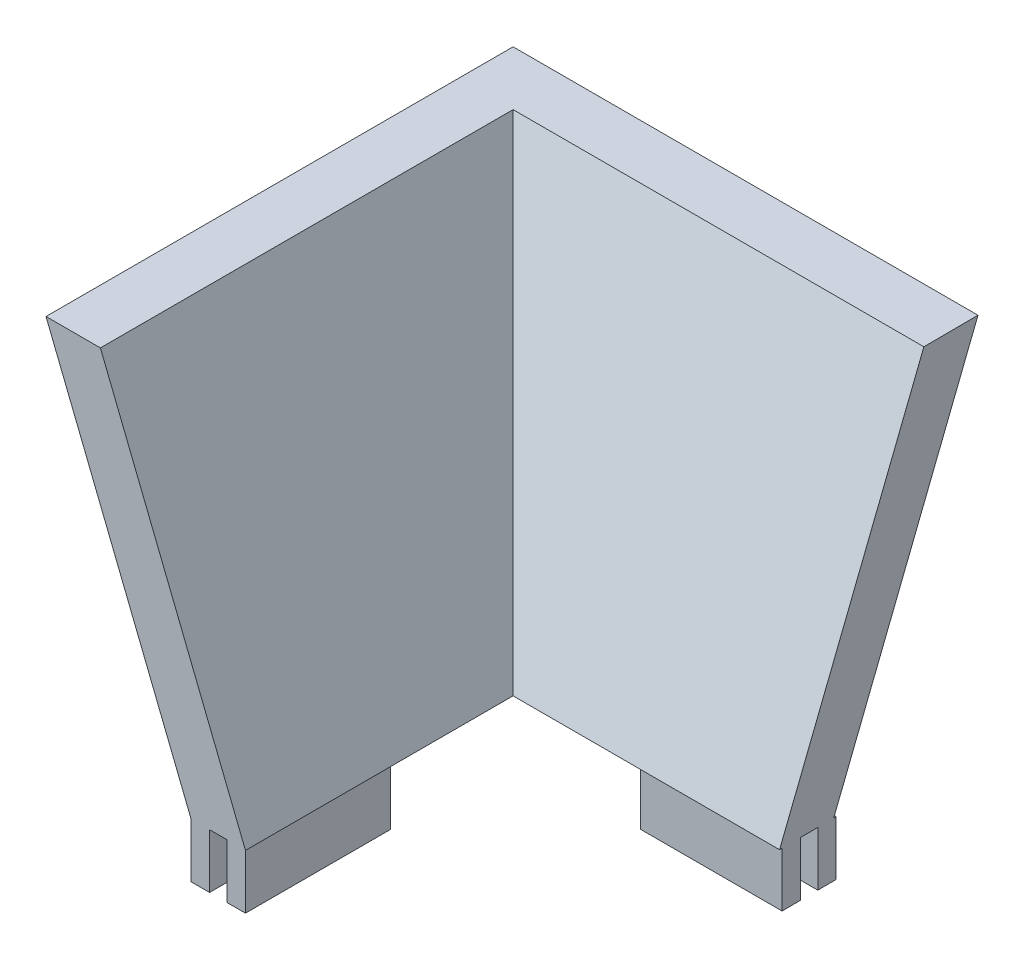
ISO-10303-21;
HEADER;
FILE_DESCRIPTION(('STEP AP214'),'2;1');
FILE_NAME('part.step','',(''),(''),'','','');
FILE_SCHEMA(('AUTOMOTIVE_DESIGN { 1 0 10303 214 1 1 1 1 }'));
ENDSEC;
DATA;
#1=APPLICATION_CONTEXT('core data for automotive mechanical design processes');
#2=APPLICATION_PROTOCOL_DEFINITION('international standard','automotive_design',2000,#1);
#3=PRODUCT_CONTEXT('',#1,'mechanical');
#4=PRODUCT('Part','Part','',(#3));
#5=PRODUCT_RELATED_PRODUCT_CATEGORY('part','',(#4));
#6=PRODUCT_DEFINITION_FORMATION('','',#4);
#7=PRODUCT_DEFINITION_CONTEXT('part definition',#1,'design');
#8=PRODUCT_DEFINITION('design','',#6,#7);
#9=PRODUCT_DEFINITION_SHAPE('','',#8);
#10=(LENGTH_UNIT() NAMED_UNIT(*) SI_UNIT(.MILLI.,.METRE.));
#11=(NAMED_UNIT(*) PLANE_ANGLE_UNIT() SI_UNIT($,.RADIAN.));
#12=(NAMED_UNIT(*) SI_UNIT($,.STERADIAN.) SOLID_ANGLE_UNIT());
#13=UNCERTAINTY_MEASURE_WITH_UNIT(LENGTH_MEASURE(1.E-05),#10,'distance_accuracy_value','');
#14=(GEOMETRIC_REPRESENTATION_CONTEXT(3) GLOBAL_UNCERTAINTY_ASSIGNED_CONTEXT((#13)) GLOBAL_UNIT_ASSIGNED_CONTEXT((#10,
#11,#12)) REPRESENTATION_CONTEXT('',''));
#15=CARTESIAN_POINT('',(0.,0.,0.));
#16=DIRECTION('',(0.,0.,1.));
#17=DIRECTION('',(1.,0.,0.));
#18=AXIS2_PLACEMENT_3D('',#15,#16,#17);
#19=CARTESIAN_POINT('',(0.,0.,0.));
#20=DIRECTION('',(0.,1.,0.));
#21=DIRECTION('',(0.,0.,1.));
#22=AXIS2_PLACEMENT_3D('',#19,#20,#21);
#23=PLANE('',#22);
#24=DIRECTION('',(-0.00505105859608031,0.,-0.999987243322163));
#25=VECTOR('',#24,1.);
#26=CARTESIAN_POINT('',(113.405509539528,0.,-0.572825181148791));
#27=LINE('',#26,#25);
#28=CARTESIAN_POINT('',(112.365335941716,0.,-206.502));
#29=VERTEX_POINT('',#28);
#30=CARTESIAN_POINT('',(112.360845493341,0.,-207.390999999989));
#31=VERTEX_POINT('',#30);
#32=EDGE_CURVE('E486',#29,#31,#27,.T.);
#33=ORIENTED_EDGE('',*,*,#32,.F.);
#34=DIRECTION('',(1.,0.,0.));
#35=VECTOR('',#34,1.);
#36=CARTESIAN_POINT('',(19.05,0.,-206.502));
#37=LINE('',#36,#35);
#38=CARTESIAN_POINT('',(19.05,0.,-206.502));
#39=VERTEX_POINT('',#38);
#40=EDGE_CURVE('E393',#39,#29,#37,.T.);
#41=ORIENTED_EDGE('',*,*,#40,.F.);
#42=DIRECTION('',(0.,0.,-1.));
#43=VECTOR('',#42,1.);
#44=CARTESIAN_POINT('',(19.05,0.,-19.05));
#45=LINE('',#44,#43);
#46=CARTESIAN_POINT('',(19.05,0.,-163.576));
#47=VERTEX_POINT('',#46);
#48=EDGE_CURVE('E389',#47,#39,#45,.T.);
#49=ORIENTED_EDGE('',*,*,#48,.F.);
#50=DIRECTION('',(1.,0.,0.));
#51=VECTOR('',#50,1.);
#52=CARTESIAN_POINT('',(12.573,0.,-163.576));
#53=LINE('',#52,#51);
#54=CARTESIAN_POINT('',(12.573,0.,-163.576));
#55=VERTEX_POINT('',#54);
#56=EDGE_CURVE('E411',#55,#47,#53,.T.);
#57=ORIENTED_EDGE('',*,*,#56,.F.);
#58=DIRECTION('',(0.,0.,-1.));
#59=VECTOR('',#58,1.);
#60=CARTESIAN_POINT('',(12.573,0.,-61.976));
#61=LINE('',#60,#59);
#62=CARTESIAN_POINT('',(12.573,0.,-112.776));
#63=VERTEX_POINT('',#62);
#64=EDGE_CURVE('E412',#63,#55,#61,.T.);
#65=ORIENTED_EDGE('',*,*,#64,.F.);
#66=DIRECTION('',(-1.,0.,0.));
#67=VECTOR('',#66,1.);
#68=CARTESIAN_POINT('',(0.,0.,-112.776));
#69=LINE('',#68,#67);
#70=CARTESIAN_POINT('',(6.477,0.,-112.776));
#71=VERTEX_POINT('',#70);
#72=EDGE_CURVE('E672',#63,#71,#69,.T.);
#73=ORIENTED_EDGE('',*,*,#72,.T.);
#74=DIRECTION('',(0.,0.,1.));
#75=VECTOR('',#74,1.);
#76=CARTESIAN_POINT('',(6.477,0.,-61.976));
#77=LINE('',#76,#75);
#78=CARTESIAN_POINT('',(6.477,0.,-163.576));
#79=VERTEX_POINT('',#78);
#80=EDGE_CURVE('E627',#79,#71,#77,.T.);
#81=ORIENTED_EDGE('',*,*,#80,.F.);
#82=DIRECTION('',(1.,0.,0.));
#83=VECTOR('',#82,1.);
#84=CARTESIAN_POINT('',(6.477,0.,-163.576));
#85=LINE('',#84,#83);
#86=CARTESIAN_POINT('',(0.,0.,-163.576));
#87=VERTEX_POINT('',#86);
#88=EDGE_CURVE('E416',#87,#79,#85,.T.);
#89=ORIENTED_EDGE('',*,*,#88,.F.);
#90=DIRECTION('',(0.,0.,-1.));
#91=VECTOR('',#90,1.);
#92=CARTESIAN_POINT('',(0.,0.,0.));
#93=LINE('',#92,#91);
#94=CARTESIAN_POINT('',(0.,0.,-225.552));
#95=VERTEX_POINT('',#94);
#96=EDGE_CURVE('E295',#87,#95,#93,.T.);
#97=ORIENTED_EDGE('',*,*,#96,.T.);
#98=DIRECTION('',(1.,0.,0.));
#99=VECTOR('',#98,1.);
#100=CARTESIAN_POINT('',(0.,0.,-225.552));
#101=LINE('',#100,#99);
#102=CARTESIAN_POINT('',(62.8650000000334,0.,-225.552));
#103=VERTEX_POINT('',#102);
#104=EDGE_CURVE('E292',#95,#103,#101,.T.);
#105=ORIENTED_EDGE('',*,*,#104,.T.);
#106=DIRECTION('',(0.,0.,-1.));
#107=VECTOR('',#106,1.);
#108=CARTESIAN_POINT('',(62.8650000000334,0.,-226.440999999988));
#109=LINE('',#108,#107);
#110=CARTESIAN_POINT('',(62.8650000000334,0.,-219.963999999988));
#111=VERTEX_POINT('',#110);
#112=EDGE_CURVE('E559',#111,#103,#109,.T.);
#113=ORIENTED_EDGE('',*,*,#112,.F.);
#114=DIRECTION('',(-1.,0.,0.));
#115=VECTOR('',#114,1.);
#116=CARTESIAN_POINT('',(62.8650000000334,0.,-219.963999999988));
#117=LINE('',#116,#115);
#118=CARTESIAN_POINT('',(112.297337723464,0.,-219.963999999989));
#119=VERTEX_POINT('',#118);
#120=EDGE_CURVE('E553',#119,#111,#117,.T.);
#121=ORIENTED_EDGE('',*,*,#120,.F.);
#122=CARTESIAN_POINT('',(112.328129369465,0.,-213.867999999989));
#123=VERTEX_POINT('',#122);
#124=EDGE_CURVE('E492',#123,#119,#27,.T.);
#125=ORIENTED_EDGE('',*,*,#124,.F.);
#126=DIRECTION('',(1.,0.,0.));
#127=VECTOR('',#126,1.);
#128=CARTESIAN_POINT('',(62.8650000000335,0.,-213.867999999988));
#129=LINE('',#128,#127);
#130=CARTESIAN_POINT('',(62.8650000000335,0.,-213.867999999988));
#131=VERTEX_POINT('',#130);
#132=EDGE_CURVE('E515',#131,#123,#129,.T.);
#133=ORIENTED_EDGE('',*,*,#132,.F.);
#134=DIRECTION('',(0.,0.,-1.));
#135=VECTOR('',#134,1.);
#136=CARTESIAN_POINT('',(62.8650000000335,0.,-207.390999999988));
#137=LINE('',#136,#135);
#138=CARTESIAN_POINT('',(62.8650000000335,0.,-207.390999999988));
#139=VERTEX_POINT('',#138);
#140=EDGE_CURVE('E686',#139,#131,#137,.T.);
#141=ORIENTED_EDGE('',*,*,#140,.F.);
#142=DIRECTION('',(-1.,0.,0.));
#143=VECTOR('',#142,1.);
#144=CARTESIAN_POINT('',(62.8650000000335,0.,-207.390999999988));
#145=LINE('',#144,#143);
#146=EDGE_CURVE('E489',#31,#139,#145,.T.);
#147=ORIENTED_EDGE('',*,*,#146,.F.);
#148=EDGE_LOOP('',(#33,#41,#49,#57,#65,#73,#81,#89,#97,#105,#113,#121,#125,#133,#141,#147));
#149=FACE_BOUND('',#148,.T.);
#150=ADVANCED_FACE('F62',(#149),#23,.F.);
#151=CARTESIAN_POINT('',(0.,127.,0.));
#152=DIRECTION('',(0.,1.,0.));
#153=DIRECTION('',(0.,0.,1.));
#154=AXIS2_PLACEMENT_3D('',#151,#152,#153);
#155=PLANE('',#154);
#156=DIRECTION('',(-1.,0.,0.));
#157=VECTOR('',#156,1.);
#158=CARTESIAN_POINT('',(259.08,127.,-257.302));
#159=LINE('',#158,#157);
#160=CARTESIAN_POINT('',(112.108738891709,127.,-257.302));
#161=VERTEX_POINT('',#160);
#162=CARTESIAN_POINT('',(-31.75,127.,-257.302));
#163=VERTEX_POINT('',#162);
#164=EDGE_CURVE('E229',#161,#163,#159,.T.);
#165=ORIENTED_EDGE('',*,*,#164,.F.);
#166=DIRECTION('',(-0.00505105859608031,0.,-0.999987243322163));
#167=VECTOR('',#166,1.);
#168=CARTESIAN_POINT('',(113.405509539528,127.,-0.572825181148791));
#169=LINE('',#168,#167);
#170=CARTESIAN_POINT('',(112.012514997956,127.,-276.352));
#171=VERTEX_POINT('',#170);
#172=EDGE_CURVE('E212',#161,#171,#169,.T.);
#173=ORIENTED_EDGE('',*,*,#172,.T.);
#174=DIRECTION('',(-1.,0.,0.));
#175=VECTOR('',#174,1.);
#176=CARTESIAN_POINT('',(278.13,127.,-276.352));
#177=LINE('',#176,#175);
#178=CARTESIAN_POINT('',(-50.8,127.,-276.352));
#179=VERTEX_POINT('',#178);
#180=EDGE_CURVE('E225',#171,#179,#177,.T.);
#181=ORIENTED_EDGE('',*,*,#180,.T.);
#182=DIRECTION('',(0.,0.,1.));
#183=VECTOR('',#182,1.);
#184=CARTESIAN_POINT('',(-50.8,127.,-276.352));
#185=LINE('',#184,#183);
#186=CARTESIAN_POINT('',(-50.8,127.,-112.776));
#187=VERTEX_POINT('',#186);
#188=EDGE_CURVE('E242',#179,#187,#185,.T.);
#189=ORIENTED_EDGE('',*,*,#188,.T.);
#190=DIRECTION('',(-1.,0.,0.));
#191=VECTOR('',#190,1.);
#192=CARTESIAN_POINT('',(0.,127.,-112.776));
#193=LINE('',#192,#191);
#194=CARTESIAN_POINT('',(-31.75,127.,-112.776));
#195=VERTEX_POINT('',#194);
#196=EDGE_CURVE('E730',#195,#187,#193,.T.);
#197=ORIENTED_EDGE('',*,*,#196,.F.);
#198=DIRECTION('',(0.,0.,1.));
#199=VECTOR('',#198,1.);
#200=CARTESIAN_POINT('',(-31.75,127.,-257.302));
#201=LINE('',#200,#199);
#202=EDGE_CURVE('E318',#163,#195,#201,.T.);
#203=ORIENTED_EDGE('',*,*,#202,.F.);
#204=EDGE_LOOP('',(#165,#173,#181,#189,#197,#203));
#205=FACE_BOUND('',#204,.T.);
#206=ADVANCED_FACE('F223',(#205),#155,.T.);
#207=CARTESIAN_POINT('',(0.,-77.7765517241379,-194.441379310345));
#208=DIRECTION('',(0.,0.371390676354104,0.928476690885259));
#209=DIRECTION('',(0.,-0.928476690885259,0.371390676354104));
#210=AXIS2_PLACEMENT_3D('',#207,#208,#209);
#211=PLANE('',#210);
#212=DIRECTION('',(-0.00187593669821545,0.928475057164789,-0.371390022865916));
#213=VECTOR('',#212,1.);
#214=CARTESIAN_POINT('',(112.425859977093,-77.5807321204548,-194.519707151818));
#215=LINE('',#214,#213);
#216=CARTESIAN_POINT('',(112.269112047963,0.,-225.552));
#217=VERTEX_POINT('',#216);
#218=EDGE_CURVE('E209',#217,#171,#215,.T.);
#219=ORIENTED_EDGE('',*,*,#218,.F.);
#220=EDGE_CURVE('E247',#103,#217,#101,.T.);
#221=ORIENTED_EDGE('',*,*,#220,.F.);
#222=ORIENTED_EDGE('',*,*,#104,.F.);
#223=DIRECTION('',(0.348155311911396,-0.870388279778489,0.348155311911396));
#224=VECTOR('',#223,1.);
#225=CARTESIAN_POINT('',(-50.8,127.,-276.352));
#226=LINE('',#225,#224);
#227=EDGE_CURVE('E240',#179,#95,#226,.T.);
#228=ORIENTED_EDGE('',*,*,#227,.F.);
#229=ORIENTED_EDGE('',*,*,#180,.F.);
#230=EDGE_LOOP('',(#219,#221,#222,#228,#229));
#231=FACE_BOUND('',#230,.T.);
#232=ADVANCED_FACE('F237',(#231),#211,.F.);
#233=CARTESIAN_POINT('',(0.,-71.2075862068965,-178.018965517241));
#234=DIRECTION('',(0.,0.371390676354104,0.928476690885259));
#235=DIRECTION('',(0.,-0.928476690885259,0.371390676354104));
#236=AXIS2_PLACEMENT_3D('',#233,#234,#235);
#237=PLANE('',#236);
#238=ORIENTED_EDGE('',*,*,#40,.T.);
#239=DIRECTION('',(-0.00187593669821545,0.928475057164789,-0.371390022865916));
#240=VECTOR('',#239,1.);
#241=CARTESIAN_POINT('',(112.50881131772,-71.011622121342,-178.097351151463));
#242=LINE('',#241,#240);
#243=EDGE_CURVE('E233',#29,#161,#242,.T.);
#244=ORIENTED_EDGE('',*,*,#243,.T.);
#245=ORIENTED_EDGE('',*,*,#164,.T.);
#246=DIRECTION('',(-0.348155311911396,0.870388279778489,-0.348155311911396));
#247=VECTOR('',#246,1.);
#248=CARTESIAN_POINT('',(19.05,0.,-206.502));
#249=LINE('',#248,#247);
#250=EDGE_CURVE('E392',#39,#163,#249,.T.);
#251=ORIENTED_EDGE('',*,*,#250,.F.);
#252=EDGE_LOOP('',(#238,#244,#245,#251));
#253=FACE_BOUND('',#252,.T.);
#254=ADVANCED_FACE('F265',(#253),#237,.T.);
#255=CARTESIAN_POINT('',(0.,0.,0.));
#256=DIRECTION('',(0.,-1.,0.));
#257=DIRECTION('',(0.,0.,-1.));
#258=AXIS2_PLACEMENT_3D('',#255,#256,#257);
#259=PLANE('',#258);
#260=DIRECTION('',(0.00505105859608031,0.,0.999987243322163));
#261=VECTOR('',#260,1.);
#262=CARTESIAN_POINT('',(113.405509539528,0.,-0.572825181148791));
#263=LINE('',#262,#261);
#264=CARTESIAN_POINT('',(112.264621599588,0.,-226.440999999989));
#265=VERTEX_POINT('',#264);
#266=EDGE_CURVE('E215',#265,#217,#263,.T.);
#267=ORIENTED_EDGE('',*,*,#266,.F.);
#268=DIRECTION('',(1.,0.,0.));
#269=VECTOR('',#268,1.);
#270=CARTESIAN_POINT('',(62.8650000000334,0.,-226.440999999988));
#271=LINE('',#270,#269);
#272=CARTESIAN_POINT('',(62.8650000000334,0.,-226.440999999988));
#273=VERTEX_POINT('',#272);
#274=EDGE_CURVE('E545',#273,#265,#271,.T.);
#275=ORIENTED_EDGE('',*,*,#274,.F.);
#276=EDGE_CURVE('E549',#103,#273,#109,.T.);
#277=ORIENTED_EDGE('',*,*,#276,.F.);
#278=ORIENTED_EDGE('',*,*,#220,.T.);
#279=EDGE_LOOP('',(#267,#275,#277,#278));
#280=FACE_BOUND('',#279,.T.);
#281=ADVANCED_FACE('F363',(#280),#259,.F.);
#282=CARTESIAN_POINT('',(62.8650000000334,-19.05,-219.963999999988));
#283=DIRECTION('',(0.,0.,-1.));
#284=DIRECTION('',(-1.,0.,0.));
#285=AXIS2_PLACEMENT_3D('',#282,#283,#284);
#286=PLANE('',#285);
#287=DIRECTION('',(0.,-1.,0.));
#288=VECTOR('',#287,1.);
#289=CARTESIAN_POINT('',(112.297337723464,-19.05,-219.963999999989));
#290=LINE('',#289,#288);
#291=CARTESIAN_POINT('',(112.297337723464,-19.05,-219.963999999989));
#292=VERTEX_POINT('',#291);
#293=EDGE_CURVE('E491',#119,#292,#290,.T.);
#294=ORIENTED_EDGE('',*,*,#293,.F.);
#295=ORIENTED_EDGE('',*,*,#120,.T.);
#296=DIRECTION('',(0.,1.,0.));
#297=VECTOR('',#296,1.);
#298=CARTESIAN_POINT('',(62.8650000000334,-19.05,-219.963999999988));
#299=LINE('',#298,#297);
#300=CARTESIAN_POINT('',(62.8650000000334,-19.05,-219.963999999988));
#301=VERTEX_POINT('',#300);
#302=EDGE_CURVE('E536',#301,#111,#299,.T.);
#303=ORIENTED_EDGE('',*,*,#302,.F.);
#304=DIRECTION('',(-1.,0.,0.));
#305=VECTOR('',#304,1.);
#306=CARTESIAN_POINT('',(62.8650000000334,-19.05,-219.963999999988));
#307=LINE('',#306,#305);
#308=EDGE_CURVE('E550',#292,#301,#307,.T.);
#309=ORIENTED_EDGE('',*,*,#308,.F.);
#310=EDGE_LOOP('',(#294,#295,#303,#309));
#311=FACE_BOUND('',#310,.T.);
#312=ADVANCED_FACE('F579',(#311),#286,.F.);
#313=CARTESIAN_POINT('',(62.8650000000334,-19.05,-226.440999999988));
#314=DIRECTION('',(0.,0.,1.));
#315=DIRECTION('',(1.,0.,0.));
#316=AXIS2_PLACEMENT_3D('',#313,#314,#315);
#317=PLANE('',#316);
#318=DIRECTION('',(0.,1.,0.));
#319=VECTOR('',#318,1.);
#320=CARTESIAN_POINT('',(112.264621599588,-19.05,-226.440999999989));
#321=LINE('',#320,#319);
#322=CARTESIAN_POINT('',(112.264621599588,-19.05,-226.440999999989));
#323=VERTEX_POINT('',#322);
#324=EDGE_CURVE('E755',#323,#265,#321,.T.);
#325=ORIENTED_EDGE('',*,*,#324,.F.);
#326=DIRECTION('',(1.,0.,0.));
#327=VECTOR('',#326,1.);
#328=CARTESIAN_POINT('',(62.8650000000334,-19.05,-226.440999999988));
#329=LINE('',#328,#327);
#330=CARTESIAN_POINT('',(62.8650000000334,-19.05,-226.440999999988));
#331=VERTEX_POINT('',#330);
#332=EDGE_CURVE('E544',#331,#323,#329,.T.);
#333=ORIENTED_EDGE('',*,*,#332,.F.);
#334=DIRECTION('',(0.,1.,0.));
#335=VECTOR('',#334,1.);
#336=CARTESIAN_POINT('',(62.8650000000334,-19.05,-226.440999999988));
#337=LINE('',#336,#335);
#338=EDGE_CURVE('E540',#331,#273,#337,.T.);
#339=ORIENTED_EDGE('',*,*,#338,.T.);
#340=ORIENTED_EDGE('',*,*,#274,.T.);
#341=EDGE_LOOP('',(#325,#333,#339,#340));
#342=FACE_BOUND('',#341,.T.);
#343=ADVANCED_FACE('F580',(#342),#317,.F.);
#344=CARTESIAN_POINT('',(0.,-19.05,0.));
#345=DIRECTION('',(0.,-1.,0.));
#346=DIRECTION('',(0.,0.,-1.));
#347=AXIS2_PLACEMENT_3D('',#344,#345,#346);
#348=PLANE('',#347);
#349=ORIENTED_EDGE('',*,*,#332,.T.);
#350=DIRECTION('',(0.00505105859608031,0.,0.999987243322163));
#351=VECTOR('',#350,1.);
#352=CARTESIAN_POINT('',(113.405509539528,-19.05,-0.572825181148791));
#353=LINE('',#352,#351);
#354=EDGE_CURVE('E232',#323,#292,#353,.T.);
#355=ORIENTED_EDGE('',*,*,#354,.T.);
#356=ORIENTED_EDGE('',*,*,#308,.T.);
#357=DIRECTION('',(0.,0.,-1.));
#358=VECTOR('',#357,1.);
#359=CARTESIAN_POINT('',(62.8650000000334,-19.05,-226.440999999988));
#360=LINE('',#359,#358);
#361=EDGE_CURVE('E777',#301,#331,#360,.T.);
#362=ORIENTED_EDGE('',*,*,#361,.T.);
#363=EDGE_LOOP('',(#349,#355,#356,#362));
#364=FACE_BOUND('',#363,.T.);
#365=ADVANCED_FACE('F582',(#364),#348,.T.);
#366=CARTESIAN_POINT('',(62.8650000000335,-19.05,-207.390999999988));
#367=DIRECTION('',(0.,0.,-1.));
#368=DIRECTION('',(-1.,0.,0.));
#369=AXIS2_PLACEMENT_3D('',#366,#367,#368);
#370=PLANE('',#369);
#371=DIRECTION('',(0.,-1.,0.));
#372=VECTOR('',#371,1.);
#373=CARTESIAN_POINT('',(112.360845493341,-19.05,-207.390999999989));
#374=LINE('',#373,#372);
#375=CARTESIAN_POINT('',(112.360845493341,-19.05,-207.390999999989));
#376=VERTEX_POINT('',#375);
#377=EDGE_CURVE('E88',#31,#376,#374,.T.);
#378=ORIENTED_EDGE('',*,*,#377,.F.);
#379=ORIENTED_EDGE('',*,*,#146,.T.);
#380=DIRECTION('',(0.,1.,0.));
#381=VECTOR('',#380,1.);
#382=CARTESIAN_POINT('',(62.8650000000335,-19.05,-207.390999999988));
#383=LINE('',#382,#381);
#384=CARTESIAN_POINT('',(62.8650000000335,-19.05,-207.390999999988));
#385=VERTEX_POINT('',#384);
#386=EDGE_CURVE('E529',#385,#139,#383,.T.);
#387=ORIENTED_EDGE('',*,*,#386,.F.);
#388=DIRECTION('',(-1.,0.,0.));
#389=VECTOR('',#388,1.);
#390=CARTESIAN_POINT('',(62.8650000000335,-19.05,-207.390999999988));
#391=LINE('',#390,#389);
#392=EDGE_CURVE('E527',#376,#385,#391,.T.);
#393=ORIENTED_EDGE('',*,*,#392,.F.);
#394=EDGE_LOOP('',(#378,#379,#387,#393));
#395=FACE_BOUND('',#394,.T.);
#396=ADVANCED_FACE('F585',(#395),#370,.F.);
#397=CARTESIAN_POINT('',(62.8650000000335,-19.05,-213.867999999988));
#398=DIRECTION('',(0.,0.,1.));
#399=DIRECTION('',(1.,0.,0.));
#400=AXIS2_PLACEMENT_3D('',#397,#398,#399);
#401=PLANE('',#400);
#402=DIRECTION('',(0.,1.,0.));
#403=VECTOR('',#402,1.);
#404=CARTESIAN_POINT('',(112.328129369465,-19.05,-213.867999999989));
#405=LINE('',#404,#403);
#406=CARTESIAN_POINT('',(112.328129369465,-19.05,-213.867999999989));
#407=VERTEX_POINT('',#406);
#408=EDGE_CURVE('E504',#407,#123,#405,.T.);
#409=ORIENTED_EDGE('',*,*,#408,.F.);
#410=DIRECTION('',(1.,0.,0.));
#411=VECTOR('',#410,1.);
#412=CARTESIAN_POINT('',(62.8650000000335,-19.05,-213.867999999988));
#413=LINE('',#412,#411);
#414=CARTESIAN_POINT('',(62.8650000000335,-19.05,-213.867999999988));
#415=VERTEX_POINT('',#414);
#416=EDGE_CURVE('E514',#415,#407,#413,.T.);
#417=ORIENTED_EDGE('',*,*,#416,.F.);
#418=DIRECTION('',(0.,1.,0.));
#419=VECTOR('',#418,1.);
#420=CARTESIAN_POINT('',(62.8650000000335,-19.05,-213.867999999988));
#421=LINE('',#420,#419);
#422=EDGE_CURVE('E523',#415,#131,#421,.T.);
#423=ORIENTED_EDGE('',*,*,#422,.T.);
#424=ORIENTED_EDGE('',*,*,#132,.T.);
#425=EDGE_LOOP('',(#409,#417,#423,#424));
#426=FACE_BOUND('',#425,.T.);
#427=ADVANCED_FACE('F512',(#426),#401,.F.);
#428=CARTESIAN_POINT('',(0.,-19.05,0.));
#429=DIRECTION('',(0.,1.,0.));
#430=DIRECTION('',(0.,0.,1.));
#431=AXIS2_PLACEMENT_3D('',#428,#429,#430);
#432=PLANE('',#431);
#433=DIRECTION('',(-0.00505105859608031,0.,-0.999987243322163));
#434=VECTOR('',#433,1.);
#435=CARTESIAN_POINT('',(113.405509539528,-19.05,-0.572825181148791));
#436=LINE('',#435,#434);
#437=EDGE_CURVE('E73',#376,#407,#436,.T.);
#438=ORIENTED_EDGE('',*,*,#437,.F.);
#439=ORIENTED_EDGE('',*,*,#392,.T.);
#440=DIRECTION('',(0.,0.,-1.));
#441=VECTOR('',#440,1.);
#442=CARTESIAN_POINT('',(62.8650000000335,-19.05,-207.390999999988));
#443=LINE('',#442,#441);
#444=EDGE_CURVE('E520',#385,#415,#443,.T.);
#445=ORIENTED_EDGE('',*,*,#444,.T.);
#446=ORIENTED_EDGE('',*,*,#416,.T.);
#447=EDGE_LOOP('',(#438,#439,#445,#446));
#448=FACE_BOUND('',#447,.T.);
#449=ADVANCED_FACE('F518',(#448),#432,.F.);
#450=CARTESIAN_POINT('',(0.,0.,0.));
#451=DIRECTION('',(0.928476690885259,0.371390676354104,0.));
#452=DIRECTION('',(-0.371390676354104,0.928476690885259,0.));
#453=AXIS2_PLACEMENT_3D('',#450,#451,#452);
#454=PLANE('',#453);
#455=DIRECTION('',(0.,0.,-1.));
#456=VECTOR('',#455,1.);
#457=CARTESIAN_POINT('',(0.,0.,-61.976));
#458=LINE('',#457,#456);
#459=CARTESIAN_POINT('',(0.,0.,-112.776));
#460=VERTEX_POINT('',#459);
#461=EDGE_CURVE('E66',#460,#87,#458,.T.);
#462=ORIENTED_EDGE('',*,*,#461,.F.);
#463=DIRECTION('',(-0.371390676354104,0.928476690885259,0.));
#464=VECTOR('',#463,1.);
#465=CARTESIAN_POINT('',(0.,0.,-112.776));
#466=LINE('',#465,#464);
#467=EDGE_CURVE('E662',#460,#187,#466,.T.);
#468=ORIENTED_EDGE('',*,*,#467,.T.);
#469=ORIENTED_EDGE('',*,*,#188,.F.);
#470=ORIENTED_EDGE('',*,*,#227,.T.);
#471=ORIENTED_EDGE('',*,*,#96,.F.);
#472=EDGE_LOOP('',(#462,#468,#469,#470,#471));
#473=FACE_BOUND('',#472,.T.);
#474=ADVANCED_FACE('F268',(#473),#454,.F.);
#475=CARTESIAN_POINT('',(16.4224137931034,6.56896551724138,0.));
#476=DIRECTION('',(0.928476690885259,0.371390676354104,0.));
#477=DIRECTION('',(-0.371390676354104,0.928476690885259,0.));
#478=AXIS2_PLACEMENT_3D('',#475,#476,#477);
#479=PLANE('',#478);
#480=DIRECTION('',(-0.371390676354104,0.928476690885259,0.));
#481=VECTOR('',#480,1.);
#482=CARTESIAN_POINT('',(16.4224137931034,6.56896551724138,-112.776));
#483=LINE('',#482,#481);
#484=CARTESIAN_POINT('',(19.05,0.,-112.776));
#485=VERTEX_POINT('',#484);
#486=EDGE_CURVE('E728',#485,#195,#483,.T.);
#487=ORIENTED_EDGE('',*,*,#486,.F.);
#488=DIRECTION('',(0.,0.,1.));
#489=VECTOR('',#488,1.);
#490=CARTESIAN_POINT('',(19.05,0.,-61.9759999999999));
#491=LINE('',#490,#489);
#492=EDGE_CURVE('E401',#47,#485,#491,.T.);
#493=ORIENTED_EDGE('',*,*,#492,.F.);
#494=ORIENTED_EDGE('',*,*,#48,.T.);
#495=ORIENTED_EDGE('',*,*,#250,.T.);
#496=ORIENTED_EDGE('',*,*,#202,.T.);
#497=EDGE_LOOP('',(#487,#493,#494,#495,#496));
#498=FACE_BOUND('',#497,.T.);
#499=ADVANCED_FACE('F366',(#498),#479,.T.);
#500=CARTESIAN_POINT('',(6.477,-19.05,-163.576));
#501=DIRECTION('',(0.,0.,1.));
#502=DIRECTION('',(1.,0.,0.));
#503=AXIS2_PLACEMENT_3D('',#500,#501,#502);
#504=PLANE('',#503);
#505=ORIENTED_EDGE('',*,*,#88,.T.);
#506=DIRECTION('',(0.,1.,0.));
#507=VECTOR('',#506,1.);
#508=CARTESIAN_POINT('',(6.477,-19.05,-163.576));
#509=LINE('',#508,#507);
#510=CARTESIAN_POINT('',(6.477,-19.05,-163.576));
#511=VERTEX_POINT('',#510);
#512=EDGE_CURVE('E450',#511,#79,#509,.T.);
#513=ORIENTED_EDGE('',*,*,#512,.F.);
#514=DIRECTION('',(1.,0.,0.));
#515=VECTOR('',#514,1.);
#516=CARTESIAN_POINT('',(6.477,-19.05,-163.576));
#517=LINE('',#516,#515);
#518=CARTESIAN_POINT('',(0.,-19.05,-163.576));
#519=VERTEX_POINT('',#518);
#520=EDGE_CURVE('E617',#519,#511,#517,.T.);
#521=ORIENTED_EDGE('',*,*,#520,.F.);
#522=DIRECTION('',(0.,1.,0.));
#523=VECTOR('',#522,1.);
#524=CARTESIAN_POINT('',(0.,-19.05,-163.576));
#525=LINE('',#524,#523);
#526=EDGE_CURVE('E446',#519,#87,#525,.T.);
#527=ORIENTED_EDGE('',*,*,#526,.T.);
#528=EDGE_LOOP('',(#505,#513,#521,#527));
#529=FACE_BOUND('',#528,.T.);
#530=ADVANCED_FACE('F364',(#529),#504,.F.);
#531=CARTESIAN_POINT('',(6.477,-19.05,-61.976));
#532=DIRECTION('',(-1.,0.,0.));
#533=DIRECTION('',(0.,0.,1.));
#534=AXIS2_PLACEMENT_3D('',#531,#532,#533);
#535=PLANE('',#534);
#536=ORIENTED_EDGE('',*,*,#80,.T.);
#537=DIRECTION('',(0.,-1.,0.));
#538=VECTOR('',#537,1.);
#539=CARTESIAN_POINT('',(6.477,-19.05,-112.776));
#540=LINE('',#539,#538);
#541=CARTESIAN_POINT('',(6.477,-19.05,-112.776));
#542=VERTEX_POINT('',#541);
#543=EDGE_CURVE('E666',#71,#542,#540,.T.);
#544=ORIENTED_EDGE('',*,*,#543,.T.);
#545=DIRECTION('',(0.,0.,1.));
#546=VECTOR('',#545,1.);
#547=CARTESIAN_POINT('',(6.477,-19.05,-61.976));
#548=LINE('',#547,#546);
#549=EDGE_CURVE('E621',#511,#542,#548,.T.);
#550=ORIENTED_EDGE('',*,*,#549,.F.);
#551=ORIENTED_EDGE('',*,*,#512,.T.);
#552=EDGE_LOOP('',(#536,#544,#550,#551));
#553=FACE_BOUND('',#552,.T.);
#554=ADVANCED_FACE('F468',(#553),#535,.F.);
#555=CARTESIAN_POINT('',(0.,-19.05,-61.976));
#556=DIRECTION('',(1.,0.,0.));
#557=DIRECTION('',(0.,0.,-1.));
#558=AXIS2_PLACEMENT_3D('',#555,#556,#557);
#559=PLANE('',#558);
#560=DIRECTION('',(0.,0.,-1.));
#561=VECTOR('',#560,1.);
#562=CARTESIAN_POINT('',(0.,-19.05,-61.976));
#563=LINE('',#562,#561);
#564=CARTESIAN_POINT('',(0.,-19.05,-112.776));
#565=VERTEX_POINT('',#564);
#566=EDGE_CURVE('E451',#565,#519,#563,.T.);
#567=ORIENTED_EDGE('',*,*,#566,.F.);
#568=DIRECTION('',(0.,1.,0.));
#569=VECTOR('',#568,1.);
#570=CARTESIAN_POINT('',(0.,-19.05,-112.776));
#571=LINE('',#570,#569);
#572=EDGE_CURVE('E670',#565,#460,#571,.T.);
#573=ORIENTED_EDGE('',*,*,#572,.T.);
#574=ORIENTED_EDGE('',*,*,#461,.T.);
#575=ORIENTED_EDGE('',*,*,#526,.F.);
#576=EDGE_LOOP('',(#567,#573,#574,#575));
#577=FACE_BOUND('',#576,.T.);
#578=ADVANCED_FACE('F458',(#577),#559,.F.);
#579=CARTESIAN_POINT('',(0.,-19.05,0.));
#580=DIRECTION('',(0.,-1.,0.));
#581=DIRECTION('',(0.,0.,-1.));
#582=AXIS2_PLACEMENT_3D('',#579,#580,#581);
#583=PLANE('',#582);
#584=DIRECTION('',(1.,0.,0.));
#585=VECTOR('',#584,1.);
#586=CARTESIAN_POINT('',(0.,-19.05,-112.776));
#587=LINE('',#586,#585);
#588=EDGE_CURVE('E665',#565,#542,#587,.T.);
#589=ORIENTED_EDGE('',*,*,#588,.F.);
#590=ORIENTED_EDGE('',*,*,#566,.T.);
#591=ORIENTED_EDGE('',*,*,#520,.T.);
#592=ORIENTED_EDGE('',*,*,#549,.T.);
#593=EDGE_LOOP('',(#589,#590,#591,#592));
#594=FACE_BOUND('',#593,.T.);
#595=ADVANCED_FACE('F467',(#594),#583,.T.);
#596=CARTESIAN_POINT('',(12.573,-19.05,-163.576));
#597=DIRECTION('',(0.,0.,1.));
#598=DIRECTION('',(1.,0.,0.));
#599=AXIS2_PLACEMENT_3D('',#596,#597,#598);
#600=PLANE('',#599);
#601=ORIENTED_EDGE('',*,*,#56,.T.);
#602=DIRECTION('',(0.,1.,0.));
#603=VECTOR('',#602,1.);
#604=CARTESIAN_POINT('',(19.05,-19.05,-163.576));
#605=LINE('',#604,#603);
#606=CARTESIAN_POINT('',(19.05,-19.05,-163.576));
#607=VERTEX_POINT('',#606);
#608=EDGE_CURVE('E406',#607,#47,#605,.T.);
#609=ORIENTED_EDGE('',*,*,#608,.F.);
#610=DIRECTION('',(1.,0.,0.));
#611=VECTOR('',#610,1.);
#612=CARTESIAN_POINT('',(12.573,-19.05,-163.576));
#613=LINE('',#612,#611);
#614=CARTESIAN_POINT('',(12.573,-19.05,-163.576));
#615=VERTEX_POINT('',#614);
#616=EDGE_CURVE('E418',#615,#607,#613,.T.);
#617=ORIENTED_EDGE('',*,*,#616,.F.);
#618=DIRECTION('',(0.,1.,0.));
#619=VECTOR('',#618,1.);
#620=CARTESIAN_POINT('',(12.573,-19.05,-163.576));
#621=LINE('',#620,#619);
#622=EDGE_CURVE('E569',#615,#55,#621,.T.);
#623=ORIENTED_EDGE('',*,*,#622,.T.);
#624=EDGE_LOOP('',(#601,#609,#617,#623));
#625=FACE_BOUND('',#624,.T.);
#626=ADVANCED_FACE('F587',(#625),#600,.F.);
#627=CARTESIAN_POINT('',(19.05,-19.05,-61.9759999999999));
#628=DIRECTION('',(-1.,0.,0.));
#629=DIRECTION('',(0.,0.,1.));
#630=AXIS2_PLACEMENT_3D('',#627,#628,#629);
#631=PLANE('',#630);
#632=ORIENTED_EDGE('',*,*,#492,.T.);
#633=DIRECTION('',(0.,-1.,0.));
#634=VECTOR('',#633,1.);
#635=CARTESIAN_POINT('',(19.05,-19.05,-112.776));
#636=LINE('',#635,#634);
#637=CARTESIAN_POINT('',(19.05,-19.05,-112.776));
#638=VERTEX_POINT('',#637);
#639=EDGE_CURVE('E403',#485,#638,#636,.T.);
#640=ORIENTED_EDGE('',*,*,#639,.T.);
#641=DIRECTION('',(0.,0.,1.));
#642=VECTOR('',#641,1.);
#643=CARTESIAN_POINT('',(19.05,-19.05,-61.9759999999999));
#644=LINE('',#643,#642);
#645=EDGE_CURVE('E606',#607,#638,#644,.T.);
#646=ORIENTED_EDGE('',*,*,#645,.F.);
#647=ORIENTED_EDGE('',*,*,#608,.T.);
#648=EDGE_LOOP('',(#632,#640,#646,#647));
#649=FACE_BOUND('',#648,.T.);
#650=ADVANCED_FACE('F402',(#649),#631,.F.);
#651=CARTESIAN_POINT('',(12.573,-19.05,-61.976));
#652=DIRECTION('',(1.,0.,0.));
#653=DIRECTION('',(0.,0.,-1.));
#654=AXIS2_PLACEMENT_3D('',#651,#652,#653);
#655=PLANE('',#654);
#656=DIRECTION('',(0.,0.,-1.));
#657=VECTOR('',#656,1.);
#658=CARTESIAN_POINT('',(12.573,-19.05,-61.976));
#659=LINE('',#658,#657);
#660=CARTESIAN_POINT('',(12.573,-19.05,-112.776));
#661=VERTEX_POINT('',#660);
#662=EDGE_CURVE('E610',#661,#615,#659,.T.);
#663=ORIENTED_EDGE('',*,*,#662,.F.);
#664=DIRECTION('',(0.,1.,0.));
#665=VECTOR('',#664,1.);
#666=CARTESIAN_POINT('',(12.573,-19.05,-112.776));
#667=LINE('',#666,#665);
#668=EDGE_CURVE('E81',#661,#63,#667,.T.);
#669=ORIENTED_EDGE('',*,*,#668,.T.);
#670=ORIENTED_EDGE('',*,*,#64,.T.);
#671=ORIENTED_EDGE('',*,*,#622,.F.);
#672=EDGE_LOOP('',(#663,#669,#670,#671));
#673=FACE_BOUND('',#672,.T.);
#674=ADVANCED_FACE('F593',(#673),#655,.F.);
#675=CARTESIAN_POINT('',(0.,-19.05,0.));
#676=DIRECTION('',(0.,1.,0.));
#677=DIRECTION('',(0.,0.,1.));
#678=AXIS2_PLACEMENT_3D('',#675,#676,#677);
#679=PLANE('',#678);
#680=ORIENTED_EDGE('',*,*,#645,.T.);
#681=DIRECTION('',(-1.,0.,0.));
#682=VECTOR('',#681,1.);
#683=CARTESIAN_POINT('',(0.,-19.05,-112.776));
#684=LINE('',#683,#682);
#685=EDGE_CURVE('E12',#638,#661,#684,.T.);
#686=ORIENTED_EDGE('',*,*,#685,.T.);
#687=ORIENTED_EDGE('',*,*,#662,.T.);
#688=ORIENTED_EDGE('',*,*,#616,.T.);
#689=EDGE_LOOP('',(#680,#686,#687,#688));
#690=FACE_BOUND('',#689,.T.);
#691=ADVANCED_FACE('F595',(#690),#679,.F.);
#692=CARTESIAN_POINT('',(62.8650000000334,-19.05,-226.440999999988));
#693=DIRECTION('',(1.,0.,0.));
#694=DIRECTION('',(0.,0.,-1.));
#695=AXIS2_PLACEMENT_3D('',#692,#693,#694);
#696=PLANE('',#695);
#697=ORIENTED_EDGE('',*,*,#112,.T.);
#698=ORIENTED_EDGE('',*,*,#276,.T.);
#699=ORIENTED_EDGE('',*,*,#338,.F.);
#700=ORIENTED_EDGE('',*,*,#361,.F.);
#701=ORIENTED_EDGE('',*,*,#302,.T.);
#702=EDGE_LOOP('',(#697,#698,#699,#700,#701));
#703=FACE_BOUND('',#702,.T.);
#704=ADVANCED_FACE('F598',(#703),#696,.F.);
#705=CARTESIAN_POINT('',(62.8650000000335,-19.05,-207.390999999988));
#706=DIRECTION('',(1.,0.,0.));
#707=DIRECTION('',(0.,0.,-1.));
#708=AXIS2_PLACEMENT_3D('',#705,#706,#707);
#709=PLANE('',#708);
#710=ORIENTED_EDGE('',*,*,#140,.T.);
#711=ORIENTED_EDGE('',*,*,#422,.F.);
#712=ORIENTED_EDGE('',*,*,#444,.F.);
#713=ORIENTED_EDGE('',*,*,#386,.T.);
#714=EDGE_LOOP('',(#710,#711,#712,#713));
#715=FACE_BOUND('',#714,.T.);
#716=ADVANCED_FACE('F603',(#715),#709,.F.);
#717=CARTESIAN_POINT('',(113.405509539528,251.206,-0.572825181148791));
#718=DIRECTION('',(0.999987243322163,0.,-0.00505105859608031));
#719=DIRECTION('',(-0.00505105859608031,0.,-0.999987243322163));
#720=AXIS2_PLACEMENT_3D('',#717,#718,#719);
#721=PLANE('',#720);
#722=ORIENTED_EDGE('',*,*,#218,.T.);
#723=ORIENTED_EDGE('',*,*,#172,.F.);
#724=ORIENTED_EDGE('',*,*,#243,.F.);
#725=ORIENTED_EDGE('',*,*,#32,.T.);
#726=ORIENTED_EDGE('',*,*,#377,.T.);
#727=ORIENTED_EDGE('',*,*,#437,.T.);
#728=ORIENTED_EDGE('',*,*,#408,.T.);
#729=ORIENTED_EDGE('',*,*,#124,.T.);
#730=ORIENTED_EDGE('',*,*,#293,.T.);
#731=ORIENTED_EDGE('',*,*,#354,.F.);
#732=ORIENTED_EDGE('',*,*,#324,.T.);
#733=ORIENTED_EDGE('',*,*,#266,.T.);
#734=EDGE_LOOP('',(#722,#723,#724,#725,#726,#727,#728,#729,#730,#731,#732,#733));
#735=FACE_BOUND('',#734,.T.);
#736=ADVANCED_FACE('F211',(#735),#721,.T.);
#737=CARTESIAN_POINT('',(0.,251.206,-112.776));
#738=DIRECTION('',(0.,0.,-1.));
#739=DIRECTION('',(-1.,0.,0.));
#740=AXIS2_PLACEMENT_3D('',#737,#738,#739);
#741=PLANE('',#740);
#742=ORIENTED_EDGE('',*,*,#588,.T.);
#743=ORIENTED_EDGE('',*,*,#543,.F.);
#744=ORIENTED_EDGE('',*,*,#72,.F.);
#745=ORIENTED_EDGE('',*,*,#668,.F.);
#746=ORIENTED_EDGE('',*,*,#685,.F.);
#747=ORIENTED_EDGE('',*,*,#639,.F.);
#748=ORIENTED_EDGE('',*,*,#486,.T.);
#749=ORIENTED_EDGE('',*,*,#196,.T.);
#750=ORIENTED_EDGE('',*,*,#467,.F.);
#751=ORIENTED_EDGE('',*,*,#572,.F.);
#752=EDGE_LOOP('',(#742,#743,#744,#745,#746,#747,#748,#749,#750,#751));
#753=FACE_BOUND('',#752,.T.);
#754=ADVANCED_FACE('F697',(#753),#741,.F.);
#755=CLOSED_SHELL('',(#150,#206,#232,#254,#281,#312,#343,#365,#396,#427,#449,#474,#499,#530,
#554,#578,#595,#626,#650,#674,#691,#704,#716,#736,#754));
#756=MANIFOLD_SOLID_BREP('B2',#755);
#757=ADVANCED_BREP_SHAPE_REPRESENTATION('',(#18,#756),#14);
#758=SHAPE_DEFINITION_REPRESENTATION(#9,#757);
ENDSEC;
END-ISO-10303-21;
